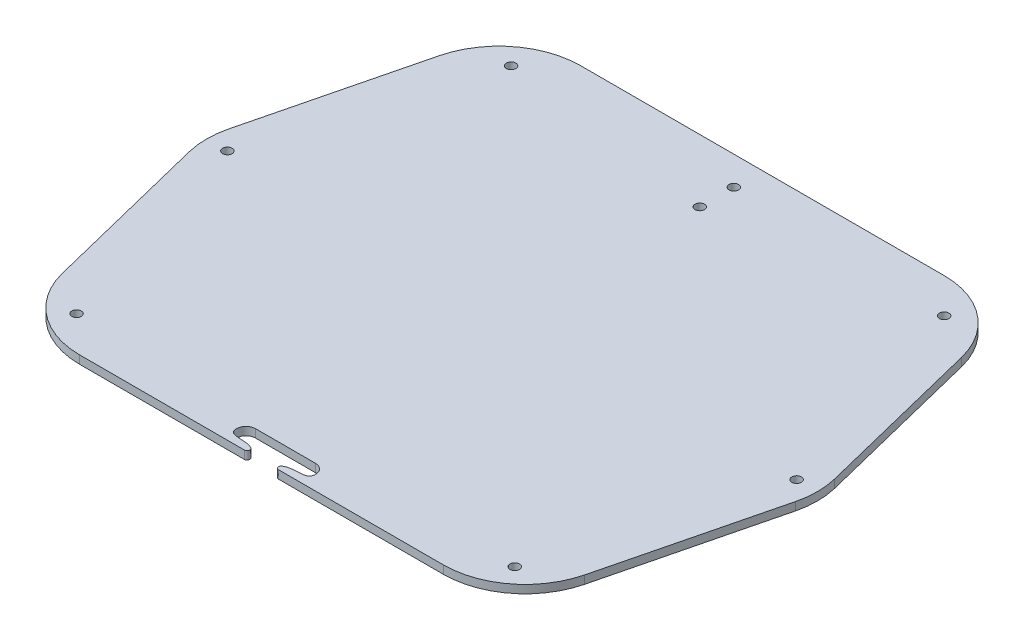
ISO-10303-21;
HEADER;
FILE_DESCRIPTION(('STEP AP214'),'2;1');
FILE_NAME('part.step','',(''),(''),'','','');
FILE_SCHEMA(('AUTOMOTIVE_DESIGN { 1 0 10303 214 1 1 1 1 }'));
ENDSEC;
DATA;
#1=APPLICATION_CONTEXT('core data for automotive mechanical design processes');
#2=APPLICATION_PROTOCOL_DEFINITION('international standard','automotive_design',2000,#1);
#3=PRODUCT_CONTEXT('',#1,'mechanical');
#4=PRODUCT('Part','Part','',(#3));
#5=PRODUCT_RELATED_PRODUCT_CATEGORY('part','',(#4));
#6=PRODUCT_DEFINITION_FORMATION('','',#4);
#7=PRODUCT_DEFINITION_CONTEXT('part definition',#1,'design');
#8=PRODUCT_DEFINITION('design','',#6,#7);
#9=PRODUCT_DEFINITION_SHAPE('','',#8);
#10=(LENGTH_UNIT() NAMED_UNIT(*) SI_UNIT(.MILLI.,.METRE.));
#11=(NAMED_UNIT(*) PLANE_ANGLE_UNIT() SI_UNIT($,.RADIAN.));
#12=(NAMED_UNIT(*) SI_UNIT($,.STERADIAN.) SOLID_ANGLE_UNIT());
#13=UNCERTAINTY_MEASURE_WITH_UNIT(LENGTH_MEASURE(1.E-05),#10,'distance_accuracy_value','');
#14=(GEOMETRIC_REPRESENTATION_CONTEXT(3) GLOBAL_UNCERTAINTY_ASSIGNED_CONTEXT((#13)) GLOBAL_UNIT_ASSIGNED_CONTEXT((#10,
#11,#12)) REPRESENTATION_CONTEXT('',''));
#15=CARTESIAN_POINT('',(0.,0.,0.));
#16=DIRECTION('',(0.,0.,1.));
#17=DIRECTION('',(1.,0.,0.));
#18=AXIS2_PLACEMENT_3D('',#15,#16,#17);
#19=CARTESIAN_POINT('',(0.,3.,29.3456606023015));
#20=DIRECTION('',(0.,0.,-1.));
#21=DIRECTION('',(-1.,0.,0.));
#22=AXIS2_PLACEMENT_3D('',#19,#20,#21);
#23=PLANE('',#22);
#24=DIRECTION('',(0.,1.,0.));
#25=VECTOR('',#24,1.);
#26=CARTESIAN_POINT('',(-6.29344842056771,-7.,29.3456606023015));
#27=LINE('',#26,#25);
#28=CARTESIAN_POINT('',(-6.29344842056771,0.,29.3456606023015));
#29=VERTEX_POINT('',#28);
#30=CARTESIAN_POINT('',(-6.29344842056771,3.,29.3456606023015));
#31=VERTEX_POINT('',#30);
#32=EDGE_CURVE('E311',#29,#31,#27,.T.);
#33=ORIENTED_EDGE('',*,*,#32,.T.);
#34=DIRECTION('',(1.,0.,0.));
#35=VECTOR('',#34,1.);
#36=CARTESIAN_POINT('',(0.,3.,29.3456606023015));
#37=LINE('',#36,#35);
#38=CARTESIAN_POINT('',(-66.7805914104085,3.,29.3456606023015));
#39=VERTEX_POINT('',#38);
#40=EDGE_CURVE('E166',#39,#31,#37,.T.);
#41=ORIENTED_EDGE('',*,*,#40,.F.);
#42=DIRECTION('',(0.,-1.,0.));
#43=VECTOR('',#42,1.);
#44=CARTESIAN_POINT('',(-66.7805914104085,3.,29.3456606023015));
#45=LINE('',#44,#43);
#46=CARTESIAN_POINT('',(-66.7805914104085,0.,29.3456606023015));
#47=VERTEX_POINT('',#46);
#48=EDGE_CURVE('E209',#39,#47,#45,.T.);
#49=ORIENTED_EDGE('',*,*,#48,.T.);
#50=DIRECTION('',(1.,0.,0.));
#51=VECTOR('',#50,1.);
#52=CARTESIAN_POINT('',(0.,0.,29.3456606023015));
#53=LINE('',#52,#51);
#54=EDGE_CURVE('E197',#47,#29,#53,.T.);
#55=ORIENTED_EDGE('',*,*,#54,.T.);
#56=EDGE_LOOP('',(#33,#41,#49,#55));
#57=FACE_BOUND('',#56,.T.);
#58=ADVANCED_FACE('F37',(#57),#23,.F.);
#59=CARTESIAN_POINT('',(121.136391037805,3.,-30.038561269979));
#60=DIRECTION('',(0.970603640808581,0.,-0.24068355251061));
#61=DIRECTION('',(-0.24068355251061,0.,-0.970603640808581));
#62=AXIS2_PLACEMENT_3D('',#59,#60,#61);
#63=PLANE('',#62);
#64=DIRECTION('',(0.24068355251061,0.,0.970603640808581));
#65=VECTOR('',#64,1.);
#66=CARTESIAN_POINT('',(121.136391037805,0.,-30.038561269979));
#67=LINE('',#66,#65);
#68=CARTESIAN_POINT('',(95.8987006346659,0.,-131.814498742093));
#69=VERTEX_POINT('',#68);
#70=CARTESIAN_POINT('',(111.265547961007,0.,-69.8446723575549));
#71=VERTEX_POINT('',#70);
#72=EDGE_CURVE('E173',#69,#71,#67,.T.);
#73=ORIENTED_EDGE('',*,*,#72,.F.);
#74=DIRECTION('',(0.,-1.,0.));
#75=VECTOR('',#74,1.);
#76=CARTESIAN_POINT('',(95.8987006346659,3.,-131.814498742093));
#77=LINE('',#76,#75);
#78=CARTESIAN_POINT('',(95.8987006346659,3.,-131.814498742093));
#79=VERTEX_POINT('',#78);
#80=EDGE_CURVE('E111',#79,#69,#77,.T.);
#81=ORIENTED_EDGE('',*,*,#80,.F.);
#82=DIRECTION('',(0.24068355251061,0.,0.970603640808581));
#83=VECTOR('',#82,1.);
#84=CARTESIAN_POINT('',(121.136391037805,3.,-30.038561269979));
#85=LINE('',#84,#83);
#86=CARTESIAN_POINT('',(111.265547961007,3.,-69.8446723575549));
#87=VERTEX_POINT('',#86);
#88=EDGE_CURVE('E205',#79,#87,#85,.T.);
#89=ORIENTED_EDGE('',*,*,#88,.T.);
#90=DIRECTION('',(0.,-1.,0.));
#91=VECTOR('',#90,1.);
#92=CARTESIAN_POINT('',(111.265547961007,3.,-69.8446723575549));
#93=LINE('',#92,#91);
#94=EDGE_CURVE('E106',#87,#71,#93,.T.);
#95=ORIENTED_EDGE('',*,*,#94,.T.);
#96=EDGE_LOOP('',(#73,#81,#89,#95));
#97=FACE_BOUND('',#96,.T.);
#98=ADVANCED_FACE('F39',(#97),#63,.T.);
#99=CARTESIAN_POINT('',(66.7805914104085,3.,-124.593992166775));
#100=DIRECTION('',(0.,-1.,0.));
#101=DIRECTION('',(0.,0.,-1.));
#102=AXIS2_PLACEMENT_3D('',#99,#100,#101);
#103=CYLINDRICAL_SURFACE('',#102,30.);
#104=CARTESIAN_POINT('',(66.7805914104085,0.,-124.593992166775));
#105=DIRECTION('',(0.,1.,0.));
#106=DIRECTION('',(0.,0.,1.));
#107=AXIS2_PLACEMENT_3D('',#104,#105,#106);
#108=CIRCLE('',#107,30.);
#109=CARTESIAN_POINT('',(66.7805914104085,0.,-154.593992166775));
#110=VERTEX_POINT('',#109);
#111=EDGE_CURVE('E176',#69,#110,#108,.T.);
#112=ORIENTED_EDGE('',*,*,#111,.T.);
#113=DIRECTION('',(0.,-1.,0.));
#114=VECTOR('',#113,1.);
#115=CARTESIAN_POINT('',(66.7805914104085,3.,-154.593992166775));
#116=LINE('',#115,#114);
#117=CARTESIAN_POINT('',(66.7805914104085,3.,-154.593992166775));
#118=VERTEX_POINT('',#117);
#119=EDGE_CURVE('E223',#118,#110,#116,.T.);
#120=ORIENTED_EDGE('',*,*,#119,.F.);
#121=CARTESIAN_POINT('',(66.7805914104085,3.,-124.593992166775));
#122=DIRECTION('',(0.,1.,0.));
#123=DIRECTION('',(0.,0.,1.));
#124=AXIS2_PLACEMENT_3D('',#121,#122,#123);
#125=CIRCLE('',#124,30.);
#126=EDGE_CURVE('E346',#79,#118,#125,.T.);
#127=ORIENTED_EDGE('',*,*,#126,.F.);
#128=ORIENTED_EDGE('',*,*,#80,.T.);
#129=EDGE_LOOP('',(#112,#120,#127,#128));
#130=FACE_BOUND('',#129,.T.);
#131=ADVANCED_FACE('F445',(#130),#103,.T.);
#132=CARTESIAN_POINT('',(0.,3.,-154.593992166775));
#133=DIRECTION('',(0.,0.,-1.));
#134=DIRECTION('',(-1.,0.,0.));
#135=AXIS2_PLACEMENT_3D('',#132,#133,#134);
#136=PLANE('',#135);
#137=DIRECTION('',(1.,0.,0.));
#138=VECTOR('',#137,1.);
#139=CARTESIAN_POINT('',(0.,0.,-154.593992166775));
#140=LINE('',#139,#138);
#141=CARTESIAN_POINT('',(-66.7805914104085,0.,-154.593992166775));
#142=VERTEX_POINT('',#141);
#143=EDGE_CURVE('E180',#142,#110,#140,.T.);
#144=ORIENTED_EDGE('',*,*,#143,.F.);
#145=DIRECTION('',(0.,-1.,0.));
#146=VECTOR('',#145,1.);
#147=CARTESIAN_POINT('',(-66.7805914104085,3.,-154.593992166775));
#148=LINE('',#147,#146);
#149=CARTESIAN_POINT('',(-66.7805914104085,3.,-154.593992166775));
#150=VERTEX_POINT('',#149);
#151=EDGE_CURVE('E221',#150,#142,#148,.T.);
#152=ORIENTED_EDGE('',*,*,#151,.F.);
#153=DIRECTION('',(1.,0.,0.));
#154=VECTOR('',#153,1.);
#155=CARTESIAN_POINT('',(0.,3.,-154.593992166775));
#156=LINE('',#155,#154);
#157=EDGE_CURVE('E348',#150,#118,#156,.T.);
#158=ORIENTED_EDGE('',*,*,#157,.T.);
#159=ORIENTED_EDGE('',*,*,#119,.T.);
#160=EDGE_LOOP('',(#144,#152,#158,#159));
#161=FACE_BOUND('',#160,.T.);
#162=ADVANCED_FACE('F449',(#161),#136,.T.);
#163=CARTESIAN_POINT('',(-66.7805914104085,3.,-124.593992166775));
#164=DIRECTION('',(0.,-1.,0.));
#165=DIRECTION('',(0.,0.,-1.));
#166=AXIS2_PLACEMENT_3D('',#163,#164,#165);
#167=CYLINDRICAL_SURFACE('',#166,30.);
#168=CARTESIAN_POINT('',(-66.7805914104085,0.,-124.593992166775));
#169=DIRECTION('',(0.,1.,0.));
#170=DIRECTION('',(0.,0.,1.));
#171=AXIS2_PLACEMENT_3D('',#168,#169,#170);
#172=CIRCLE('',#171,30.);
#173=CARTESIAN_POINT('',(-95.8987006346659,0.,-131.814498742093));
#174=VERTEX_POINT('',#173);
#175=EDGE_CURVE('E183',#142,#174,#172,.T.);
#176=ORIENTED_EDGE('',*,*,#175,.T.);
#177=DIRECTION('',(0.,-1.,0.));
#178=VECTOR('',#177,1.);
#179=CARTESIAN_POINT('',(-95.8987006346659,3.,-131.814498742093));
#180=LINE('',#179,#178);
#181=CARTESIAN_POINT('',(-95.8987006346659,3.,-131.814498742093));
#182=VERTEX_POINT('',#181);
#183=EDGE_CURVE('E218',#182,#174,#180,.T.);
#184=ORIENTED_EDGE('',*,*,#183,.F.);
#185=CARTESIAN_POINT('',(-66.7805914104085,3.,-124.593992166775));
#186=DIRECTION('',(0.,1.,0.));
#187=DIRECTION('',(0.,0.,1.));
#188=AXIS2_PLACEMENT_3D('',#185,#186,#187);
#189=CIRCLE('',#188,30.);
#190=EDGE_CURVE('E351',#150,#182,#189,.T.);
#191=ORIENTED_EDGE('',*,*,#190,.F.);
#192=ORIENTED_EDGE('',*,*,#151,.T.);
#193=EDGE_LOOP('',(#176,#184,#191,#192));
#194=FACE_BOUND('',#193,.T.);
#195=ADVANCED_FACE('F454',(#194),#167,.T.);
#196=CARTESIAN_POINT('',(-121.136391037805,3.,-30.038561269979));
#197=DIRECTION('',(0.970603640808581,0.,0.24068355251061));
#198=DIRECTION('',(0.24068355251061,0.,-0.970603640808581));
#199=AXIS2_PLACEMENT_3D('',#196,#197,#198);
#200=PLANE('',#199);
#201=DIRECTION('',(-0.24068355251061,0.,0.970603640808581));
#202=VECTOR('',#201,1.);
#203=CARTESIAN_POINT('',(-121.136391037805,0.,-30.038561269979));
#204=LINE('',#203,#202);
#205=CARTESIAN_POINT('',(-111.265547961007,0.,-69.8446723575549));
#206=VERTEX_POINT('',#205);
#207=EDGE_CURVE('E185',#174,#206,#204,.T.);
#208=ORIENTED_EDGE('',*,*,#207,.T.);
#209=DIRECTION('',(0.,-1.,0.));
#210=VECTOR('',#209,1.);
#211=CARTESIAN_POINT('',(-111.265547961007,3.,-69.8446723575549));
#212=LINE('',#211,#210);
#213=CARTESIAN_POINT('',(-111.265547961007,3.,-69.8446723575549));
#214=VERTEX_POINT('',#213);
#215=EDGE_CURVE('E215',#214,#206,#212,.T.);
#216=ORIENTED_EDGE('',*,*,#215,.F.);
#217=DIRECTION('',(-0.24068355251061,0.,0.970603640808581));
#218=VECTOR('',#217,1.);
#219=CARTESIAN_POINT('',(-121.136391037805,3.,-30.038561269979));
#220=LINE('',#219,#218);
#221=EDGE_CURVE('E353',#182,#214,#220,.T.);
#222=ORIENTED_EDGE('',*,*,#221,.F.);
#223=ORIENTED_EDGE('',*,*,#183,.T.);
#224=EDGE_LOOP('',(#208,#216,#222,#223));
#225=FACE_BOUND('',#224,.T.);
#226=ADVANCED_FACE('F458',(#225),#200,.F.);
#227=CARTESIAN_POINT('',(-82.1474387367497,3.,-62.6241657822366));
#228=DIRECTION('',(0.,-1.,0.));
#229=DIRECTION('',(0.,0.,-1.));
#230=AXIS2_PLACEMENT_3D('',#227,#228,#229);
#231=CYLINDRICAL_SURFACE('',#230,30.);
#232=CARTESIAN_POINT('',(-82.1474387367497,0.,-62.6241657822366));
#233=DIRECTION('',(0.,1.,0.));
#234=DIRECTION('',(0.,0.,1.));
#235=AXIS2_PLACEMENT_3D('',#232,#233,#234);
#236=CIRCLE('',#235,30.);
#237=CARTESIAN_POINT('',(-111.265547961007,0.,-55.4036592069183));
#238=VERTEX_POINT('',#237);
#239=EDGE_CURVE('E187',#206,#238,#236,.T.);
#240=ORIENTED_EDGE('',*,*,#239,.T.);
#241=DIRECTION('',(0.,-1.,0.));
#242=VECTOR('',#241,1.);
#243=CARTESIAN_POINT('',(-111.265547961007,3.,-55.4036592069183));
#244=LINE('',#243,#242);
#245=CARTESIAN_POINT('',(-111.265547961007,3.,-55.4036592069183));
#246=VERTEX_POINT('',#245);
#247=EDGE_CURVE('E213',#246,#238,#244,.T.);
#248=ORIENTED_EDGE('',*,*,#247,.F.);
#249=CARTESIAN_POINT('',(-82.1474387367497,3.,-62.6241657822366));
#250=DIRECTION('',(0.,1.,0.));
#251=DIRECTION('',(0.,0.,1.));
#252=AXIS2_PLACEMENT_3D('',#249,#250,#251);
#253=CIRCLE('',#252,30.);
#254=EDGE_CURVE('E355',#214,#246,#253,.T.);
#255=ORIENTED_EDGE('',*,*,#254,.F.);
#256=ORIENTED_EDGE('',*,*,#215,.T.);
#257=EDGE_LOOP('',(#240,#248,#255,#256));
#258=FACE_BOUND('',#257,.T.);
#259=ADVANCED_FACE('F461',(#258),#231,.T.);
#260=CARTESIAN_POINT('',(-91.8773371714655,3.,22.7831042208141));
#261=DIRECTION('',(-0.970603640808581,0.,0.24068355251061));
#262=DIRECTION('',(0.24068355251061,0.,0.970603640808581));
#263=AXIS2_PLACEMENT_3D('',#260,#261,#262);
#264=PLANE('',#263);
#265=DIRECTION('',(-0.24068355251061,0.,-0.970603640808581));
#266=VECTOR('',#265,1.);
#267=CARTESIAN_POINT('',(-91.8773371714655,0.,22.7831042208141));
#268=LINE('',#267,#266);
#269=CARTESIAN_POINT('',(-95.8987006346659,0.,6.56616717761984));
#270=VERTEX_POINT('',#269);
#271=EDGE_CURVE('E190',#270,#238,#268,.T.);
#272=ORIENTED_EDGE('',*,*,#271,.F.);
#273=DIRECTION('',(0.,-1.,0.));
#274=VECTOR('',#273,1.);
#275=CARTESIAN_POINT('',(-95.8987006346659,3.,6.56616717761984));
#276=LINE('',#275,#274);
#277=CARTESIAN_POINT('',(-95.8987006346659,3.,6.56616717761984));
#278=VERTEX_POINT('',#277);
#279=EDGE_CURVE('E211',#278,#270,#276,.T.);
#280=ORIENTED_EDGE('',*,*,#279,.F.);
#281=DIRECTION('',(-0.24068355251061,0.,-0.970603640808581));
#282=VECTOR('',#281,1.);
#283=CARTESIAN_POINT('',(-91.8773371714655,3.,22.7831042208141));
#284=LINE('',#283,#282);
#285=EDGE_CURVE('E357',#278,#246,#284,.T.);
#286=ORIENTED_EDGE('',*,*,#285,.T.);
#287=ORIENTED_EDGE('',*,*,#247,.T.);
#288=EDGE_LOOP('',(#272,#280,#286,#287));
#289=FACE_BOUND('',#288,.T.);
#290=ADVANCED_FACE('F373',(#289),#264,.T.);
#291=CARTESIAN_POINT('',(-66.7805914104085,3.,-0.654339397698461));
#292=DIRECTION('',(0.,-1.,0.));
#293=DIRECTION('',(0.,0.,-1.));
#294=AXIS2_PLACEMENT_3D('',#291,#292,#293);
#295=CYLINDRICAL_SURFACE('',#294,30.);
#296=CARTESIAN_POINT('',(-66.7805914104085,0.,-0.654339397698461));
#297=DIRECTION('',(0.,1.,0.));
#298=DIRECTION('',(0.,0.,1.));
#299=AXIS2_PLACEMENT_3D('',#296,#297,#298);
#300=CIRCLE('',#299,30.);
#301=EDGE_CURVE('E193',#47,#270,#300,.F.);
#302=ORIENTED_EDGE('',*,*,#301,.F.);
#303=ORIENTED_EDGE('',*,*,#48,.F.);
#304=CARTESIAN_POINT('',(-66.7805914104085,3.,-0.654339397698461));
#305=DIRECTION('',(0.,1.,0.));
#306=DIRECTION('',(0.,0.,1.));
#307=AXIS2_PLACEMENT_3D('',#304,#305,#306);
#308=CIRCLE('',#307,30.);
#309=EDGE_CURVE('E359',#39,#278,#308,.F.);
#310=ORIENTED_EDGE('',*,*,#309,.T.);
#311=ORIENTED_EDGE('',*,*,#279,.T.);
#312=EDGE_LOOP('',(#302,#303,#310,#311));
#313=FACE_BOUND('',#312,.T.);
#314=ADVANCED_FACE('F364',(#313),#295,.T.);
#315=CARTESIAN_POINT('',(6.29344842056773,3.,29.3456606023015));
#316=VERTEX_POINT('',#315);
#317=CARTESIAN_POINT('',(66.7805914104085,3.,29.3456606023015));
#318=VERTEX_POINT('',#317);
#319=EDGE_CURVE('E164',#316,#318,#37,.T.);
#320=ORIENTED_EDGE('',*,*,#319,.F.);
#321=DIRECTION('',(0.,1.,0.));
#322=VECTOR('',#321,1.);
#323=CARTESIAN_POINT('',(6.29344842056773,-7.,29.3456606023015));
#324=LINE('',#323,#322);
#325=CARTESIAN_POINT('',(6.29344842056773,0.,29.3456606023015));
#326=VERTEX_POINT('',#325);
#327=EDGE_CURVE('E308',#326,#316,#324,.T.);
#328=ORIENTED_EDGE('',*,*,#327,.F.);
#329=CARTESIAN_POINT('',(66.7805914104085,0.,29.3456606023015));
#330=VERTEX_POINT('',#329);
#331=EDGE_CURVE('E196',#326,#330,#53,.T.);
#332=ORIENTED_EDGE('',*,*,#331,.T.);
#333=DIRECTION('',(0.,-1.,0.));
#334=VECTOR('',#333,1.);
#335=CARTESIAN_POINT('',(66.7805914104085,3.,29.3456606023015));
#336=LINE('',#335,#334);
#337=EDGE_CURVE('E152',#318,#330,#336,.T.);
#338=ORIENTED_EDGE('',*,*,#337,.F.);
#339=EDGE_LOOP('',(#320,#328,#332,#338));
#340=FACE_BOUND('',#339,.T.);
#341=ADVANCED_FACE('F438',(#340),#23,.F.);
#342=CARTESIAN_POINT('',(66.7805914104085,3.,-0.654339397698461));
#343=DIRECTION('',(0.,-1.,0.));
#344=DIRECTION('',(0.,0.,-1.));
#345=AXIS2_PLACEMENT_3D('',#342,#343,#344);
#346=CYLINDRICAL_SURFACE('',#345,30.);
#347=CARTESIAN_POINT('',(66.7805914104085,0.,-0.654339397698461));
#348=DIRECTION('',(0.,1.,0.));
#349=DIRECTION('',(0.,0.,1.));
#350=AXIS2_PLACEMENT_3D('',#347,#348,#349);
#351=CIRCLE('',#350,30.);
#352=CARTESIAN_POINT('',(95.8987006346659,0.,6.56616717761984));
#353=VERTEX_POINT('',#352);
#354=EDGE_CURVE('E149',#353,#330,#351,.F.);
#355=ORIENTED_EDGE('',*,*,#354,.F.);
#356=DIRECTION('',(0.,-1.,0.));
#357=VECTOR('',#356,1.);
#358=CARTESIAN_POINT('',(95.8987006346659,3.,6.56616717761984));
#359=LINE('',#358,#357);
#360=CARTESIAN_POINT('',(95.8987006346659,3.,6.56616717761984));
#361=VERTEX_POINT('',#360);
#362=EDGE_CURVE('E142',#361,#353,#359,.T.);
#363=ORIENTED_EDGE('',*,*,#362,.F.);
#364=CARTESIAN_POINT('',(66.7805914104085,3.,-0.654339397698461));
#365=DIRECTION('',(0.,1.,0.));
#366=DIRECTION('',(0.,0.,1.));
#367=AXIS2_PLACEMENT_3D('',#364,#365,#366);
#368=CIRCLE('',#367,30.);
#369=EDGE_CURVE('E147',#361,#318,#368,.F.);
#370=ORIENTED_EDGE('',*,*,#369,.T.);
#371=ORIENTED_EDGE('',*,*,#337,.T.);
#372=EDGE_LOOP('',(#355,#363,#370,#371));
#373=FACE_BOUND('',#372,.T.);
#374=ADVANCED_FACE('F144',(#373),#346,.T.);
#375=CARTESIAN_POINT('',(91.8773371714655,3.,22.783104220814));
#376=DIRECTION('',(-0.970603640808581,0.,-0.24068355251061));
#377=DIRECTION('',(-0.24068355251061,0.,0.970603640808581));
#378=AXIS2_PLACEMENT_3D('',#375,#376,#377);
#379=PLANE('',#378);
#380=DIRECTION('',(0.24068355251061,0.,-0.970603640808581));
#381=VECTOR('',#380,1.);
#382=CARTESIAN_POINT('',(91.8773371714655,0.,22.783104220814));
#383=LINE('',#382,#381);
#384=CARTESIAN_POINT('',(111.265547961007,0.,-55.4036592069183));
#385=VERTEX_POINT('',#384);
#386=EDGE_CURVE('E201',#353,#385,#383,.T.);
#387=ORIENTED_EDGE('',*,*,#386,.T.);
#388=DIRECTION('',(0.,-1.,0.));
#389=VECTOR('',#388,1.);
#390=CARTESIAN_POINT('',(111.265547961007,3.,-55.4036592069183));
#391=LINE('',#390,#389);
#392=CARTESIAN_POINT('',(111.265547961007,3.,-55.4036592069183));
#393=VERTEX_POINT('',#392);
#394=EDGE_CURVE('E153',#393,#385,#391,.T.);
#395=ORIENTED_EDGE('',*,*,#394,.F.);
#396=DIRECTION('',(0.24068355251061,0.,-0.970603640808581));
#397=VECTOR('',#396,1.);
#398=CARTESIAN_POINT('',(91.8773371714655,3.,22.783104220814));
#399=LINE('',#398,#397);
#400=EDGE_CURVE('E156',#361,#393,#399,.T.);
#401=ORIENTED_EDGE('',*,*,#400,.F.);
#402=ORIENTED_EDGE('',*,*,#362,.T.);
#403=EDGE_LOOP('',(#387,#395,#401,#402));
#404=FACE_BOUND('',#403,.T.);
#405=ADVANCED_FACE('F157',(#404),#379,.F.);
#406=CARTESIAN_POINT('',(82.1474387367497,3.,-62.6241657822366));
#407=DIRECTION('',(0.,-1.,0.));
#408=DIRECTION('',(0.,0.,-1.));
#409=AXIS2_PLACEMENT_3D('',#406,#407,#408);
#410=CYLINDRICAL_SURFACE('',#409,30.);
#411=CARTESIAN_POINT('',(82.1474387367497,0.,-62.6241657822366));
#412=DIRECTION('',(0.,1.,0.));
#413=DIRECTION('',(0.,0.,1.));
#414=AXIS2_PLACEMENT_3D('',#411,#412,#413);
#415=CIRCLE('',#414,30.);
#416=EDGE_CURVE('E203',#385,#71,#415,.T.);
#417=ORIENTED_EDGE('',*,*,#416,.T.);
#418=ORIENTED_EDGE('',*,*,#94,.F.);
#419=CARTESIAN_POINT('',(82.1474387367497,3.,-62.6241657822366));
#420=DIRECTION('',(0.,1.,0.));
#421=DIRECTION('',(0.,0.,1.));
#422=AXIS2_PLACEMENT_3D('',#419,#420,#421);
#423=CIRCLE('',#422,30.);
#424=EDGE_CURVE('E61',#393,#87,#423,.T.);
#425=ORIENTED_EDGE('',*,*,#424,.F.);
#426=ORIENTED_EDGE('',*,*,#394,.T.);
#427=EDGE_LOOP('',(#417,#418,#425,#426));
#428=FACE_BOUND('',#427,.T.);
#429=ADVANCED_FACE('F441',(#428),#410,.T.);
#430=CARTESIAN_POINT('',(0.,3.,0.));
#431=DIRECTION('',(0.,1.,0.));
#432=DIRECTION('',(0.,0.,1.));
#433=AXIS2_PLACEMENT_3D('',#430,#431,#432);
#434=PLANE('',#433);
#435=CARTESIAN_POINT('',(6.29344842056773,3.,28.3456606023015));
#436=DIRECTION('',(0.,-1.,0.));
#437=DIRECTION('',(0.,0.,1.));
#438=AXIS2_PLACEMENT_3D('',#435,#436,#437);
#439=CIRCLE('',#438,1.);
#440=CARTESIAN_POINT('',(5.80457635502105,3.,27.4733051108142));
#441=VERTEX_POINT('',#440);
#442=EDGE_CURVE('E306',#316,#441,#439,.T.);
#443=ORIENTED_EDGE('',*,*,#442,.F.);
#444=ORIENTED_EDGE('',*,*,#319,.T.);
#445=ORIENTED_EDGE('',*,*,#369,.F.);
#446=ORIENTED_EDGE('',*,*,#400,.T.);
#447=ORIENTED_EDGE('',*,*,#424,.T.);
#448=ORIENTED_EDGE('',*,*,#88,.F.);
#449=ORIENTED_EDGE('',*,*,#126,.T.);
#450=ORIENTED_EDGE('',*,*,#157,.F.);
#451=ORIENTED_EDGE('',*,*,#190,.T.);
#452=ORIENTED_EDGE('',*,*,#221,.T.);
#453=ORIENTED_EDGE('',*,*,#254,.T.);
#454=ORIENTED_EDGE('',*,*,#285,.F.);
#455=ORIENTED_EDGE('',*,*,#309,.F.);
#456=ORIENTED_EDGE('',*,*,#40,.T.);
#457=CARTESIAN_POINT('',(-6.29344842056771,3.,28.3456606023015));
#458=DIRECTION('',(0.,-1.,0.));
#459=DIRECTION('',(0.,0.,1.));
#460=AXIS2_PLACEMENT_3D('',#457,#458,#459);
#461=CIRCLE('',#460,1.);
#462=CARTESIAN_POINT('',(-5.80457635502104,3.,27.4733051108142));
#463=VERTEX_POINT('',#462);
#464=EDGE_CURVE('E427',#463,#31,#461,.T.);
#465=ORIENTED_EDGE('',*,*,#464,.F.);
#466=CARTESIAN_POINT('',(-14.3784570925038,3.,24.9876745493891));
#467=CARTESIAN_POINT('',(-14.0506615471462,3.,26.1193369399275));
#468=CARTESIAN_POINT('',(-10.489346866623,3.,26.7600909903028));
#469=CARTESIAN_POINT('',(-7.72474957365098,3.,26.4937574664827));
#470=CARTESIAN_POINT('',(-5.90450881564876,3.,27.4173024961474));
#471=CARTESIAN_POINT('',(-5.80457635502104,3.,27.4733051108142));
#472=B_SPLINE_CURVE_WITH_KNOTS('',3,(#466,#467,#468,#469,#470,#471),.UNSPECIFIED.,.F.,.F.,(4,1,
1,4),(0.,0.27412385349263,0.745489655390744,0.777393607827548),.UNSPECIFIED.);
#473=CARTESIAN_POINT('',(-14.3784570925038,3.,24.9876745493891));
#474=VERTEX_POINT('',#473);
#475=EDGE_CURVE('E419',#474,#463,#472,.T.);
#476=ORIENTED_EDGE('',*,*,#475,.F.);
#477=CARTESIAN_POINT('',(-11.0166480970681,3.,24.0138982515634));
#478=DIRECTION('',(0.,1.,0.));
#479=DIRECTION('',(0.,0.,1.));
#480=AXIS2_PLACEMENT_3D('',#477,#478,#479);
#481=CIRCLE('',#480,3.5);
#482=CARTESIAN_POINT('',(-11.0166480970681,3.,20.5138982515634));
#483=VERTEX_POINT('',#482);
#484=EDGE_CURVE('E417',#483,#474,#481,.T.);
#485=ORIENTED_EDGE('',*,*,#484,.F.);
#486=DIRECTION('',(-1.,0.,0.));
#487=VECTOR('',#486,1.);
#488=CARTESIAN_POINT('',(11.0166480970681,3.,20.5138982515634));
#489=LINE('',#488,#487);
#490=CARTESIAN_POINT('',(11.0166480970681,3.,20.5138982515634));
#491=VERTEX_POINT('',#490);
#492=EDGE_CURVE('E408',#491,#483,#489,.T.);
#493=ORIENTED_EDGE('',*,*,#492,.F.);
#494=CARTESIAN_POINT('',(11.0166480970681,3.,24.0138982515634));
#495=DIRECTION('',(0.,1.,0.));
#496=DIRECTION('',(0.,0.,1.));
#497=AXIS2_PLACEMENT_3D('',#494,#495,#496);
#498=CIRCLE('',#497,3.5);
#499=CARTESIAN_POINT('',(14.3784570925038,3.,24.9876745493891));
#500=VERTEX_POINT('',#499);
#501=EDGE_CURVE('E412',#500,#491,#498,.T.);
#502=ORIENTED_EDGE('',*,*,#501,.F.);
#503=CARTESIAN_POINT('',(5.80457635502104,3.,27.4733051108142));
#504=CARTESIAN_POINT('',(5.90450881564877,3.,27.4173024961474));
#505=CARTESIAN_POINT('',(7.724749573651,3.,26.4937574664827));
#506=CARTESIAN_POINT('',(10.489346866623,3.,26.7600909903028));
#507=CARTESIAN_POINT('',(14.0506615471462,3.,26.1193369399275));
#508=CARTESIAN_POINT('',(14.3784570925038,3.,24.9876745493891));
#509=B_SPLINE_CURVE_WITH_KNOTS('',3,(#503,#504,#505,#506,#507,#508),.UNSPECIFIED.,.F.,.F.,(4,1,
1,4),(0.,0.0319039524368033,0.503269754334918,0.777393607827548),.UNSPECIFIED.);
#510=EDGE_CURVE('E327',#441,#500,#509,.T.);
#511=ORIENTED_EDGE('',*,*,#510,.F.);
#512=EDGE_LOOP('',(#443,#444,#445,#446,#447,#448,#449,#450,#451,#452,#453,#454,#455,#456,#465,
#476,#485,#493,#502,#511));
#513=FACE_BOUND('',#512,.T.);
#514=CARTESIAN_POINT('',(79.5,3.,-141.782265329937));
#515=DIRECTION('',(0.,1.,0.));
#516=DIRECTION('',(0.,0.,1.));
#517=AXIS2_PLACEMENT_3D('',#514,#515,#516);
#518=CIRCLE('',#517,1.75);
#519=CARTESIAN_POINT('',(79.5,3.,-140.032265329937));
#520=VERTEX_POINT('',#519);
#521=EDGE_CURVE('E256',#520,#520,#518,.T.);
#522=ORIENTED_EDGE('',*,*,#521,.F.);
#523=EDGE_LOOP('',(#522));
#524=FACE_BOUND('',#523,.T.);
#525=CARTESIAN_POINT('',(-79.5,3.,-141.782265329937));
#526=DIRECTION('',(0.,1.,0.));
#527=DIRECTION('',(0.,0.,1.));
#528=AXIS2_PLACEMENT_3D('',#525,#526,#527);
#529=CIRCLE('',#528,1.75);
#530=CARTESIAN_POINT('',(-79.5,3.,-140.032265329937));
#531=VERTEX_POINT('',#530);
#532=EDGE_CURVE('E252',#531,#531,#529,.T.);
#533=ORIENTED_EDGE('',*,*,#532,.F.);
#534=EDGE_LOOP('',(#533));
#535=FACE_BOUND('',#534,.T.);
#536=CARTESIAN_POINT('',(0.,3.,-144.079729863551));
#537=DIRECTION('',(0.,1.,0.));
#538=DIRECTION('',(0.,0.,1.));
#539=AXIS2_PLACEMENT_3D('',#536,#537,#538);
#540=CIRCLE('',#539,1.75);
#541=CARTESIAN_POINT('',(0.,3.,-142.329729863551));
#542=VERTEX_POINT('',#541);
#543=EDGE_CURVE('E248',#542,#542,#540,.T.);
#544=ORIENTED_EDGE('',*,*,#543,.F.);
#545=EDGE_LOOP('',(#544));
#546=FACE_BOUND('',#545,.T.);
#547=CARTESIAN_POINT('',(0.,3.,-131.568155220661));
#548=DIRECTION('',(0.,1.,0.));
#549=DIRECTION('',(0.,0.,1.));
#550=AXIS2_PLACEMENT_3D('',#547,#548,#549);
#551=CIRCLE('',#550,1.75);
#552=CARTESIAN_POINT('',(0.,3.,-129.818155220661));
#553=VERTEX_POINT('',#552);
#554=EDGE_CURVE('E244',#553,#553,#551,.T.);
#555=ORIENTED_EDGE('',*,*,#554,.F.);
#556=EDGE_LOOP('',(#555));
#557=FACE_BOUND('',#556,.T.);
#558=CARTESIAN_POINT('',(-80.4501847084653,3.,16.8189513065068));
#559=DIRECTION('',(0.,1.,0.));
#560=DIRECTION('',(0.,0.,1.));
#561=AXIS2_PLACEMENT_3D('',#558,#559,#560);
#562=CIRCLE('',#561,1.75);
#563=CARTESIAN_POINT('',(-80.4501847084653,3.,18.5689513065068));
#564=VERTEX_POINT('',#563);
#565=EDGE_CURVE('E234',#564,#564,#562,.T.);
#566=ORIENTED_EDGE('',*,*,#565,.F.);
#567=EDGE_LOOP('',(#566));
#568=FACE_BOUND('',#567,.T.);
#569=CARTESIAN_POINT('',(104.507530950677,3.,-62.6241657822366));
#570=DIRECTION('',(0.,1.,0.));
#571=DIRECTION('',(0.,0.,1.));
#572=AXIS2_PLACEMENT_3D('',#569,#570,#571);
#573=CIRCLE('',#572,1.75);
#574=CARTESIAN_POINT('',(104.507530950677,3.,-60.8741657822366));
#575=VERTEX_POINT('',#574);
#576=EDGE_CURVE('E338',#575,#575,#573,.T.);
#577=ORIENTED_EDGE('',*,*,#576,.F.);
#578=EDGE_LOOP('',(#577));
#579=FACE_BOUND('',#578,.T.);
#580=CARTESIAN_POINT('',(80.4501847084653,3.,16.8189513065068));
#581=DIRECTION('',(0.,1.,0.));
#582=DIRECTION('',(0.,0.,1.));
#583=AXIS2_PLACEMENT_3D('',#580,#581,#582);
#584=CIRCLE('',#583,1.75);
#585=CARTESIAN_POINT('',(80.4501847084653,3.,18.5689513065068));
#586=VERTEX_POINT('',#585);
#587=EDGE_CURVE('E243',#586,#586,#584,.T.);
#588=ORIENTED_EDGE('',*,*,#587,.F.);
#589=EDGE_LOOP('',(#588));
#590=FACE_BOUND('',#589,.T.);
#591=CARTESIAN_POINT('',(-104.507530950677,3.,-62.6241657822366));
#592=DIRECTION('',(0.,1.,0.));
#593=DIRECTION('',(0.,0.,1.));
#594=AXIS2_PLACEMENT_3D('',#591,#592,#593);
#595=CIRCLE('',#594,1.75);
#596=CARTESIAN_POINT('',(-104.507530950677,3.,-60.8741657822366));
#597=VERTEX_POINT('',#596);
#598=EDGE_CURVE('E229',#597,#597,#595,.T.);
#599=ORIENTED_EDGE('',*,*,#598,.F.);
#600=EDGE_LOOP('',(#599));
#601=FACE_BOUND('',#600,.T.);
#602=ADVANCED_FACE('F161',(#513,#524,#535,#546,#557,#568,#579,#590,#601),#434,.T.);
#603=CARTESIAN_POINT('',(0.,0.,0.));
#604=DIRECTION('',(0.,1.,0.));
#605=DIRECTION('',(0.,0.,1.));
#606=AXIS2_PLACEMENT_3D('',#603,#604,#605);
#607=PLANE('',#606);
#608=ORIENTED_EDGE('',*,*,#331,.F.);
#609=CARTESIAN_POINT('',(6.29344842056773,0.,28.3456606023015));
#610=DIRECTION('',(0.,1.,0.));
#611=DIRECTION('',(0.,0.,1.));
#612=AXIS2_PLACEMENT_3D('',#609,#610,#611);
#613=CIRCLE('',#612,1.);
#614=CARTESIAN_POINT('',(5.80457635502105,0.,27.4733051108142));
#615=VERTEX_POINT('',#614);
#616=EDGE_CURVE('E11',#326,#615,#613,.F.);
#617=ORIENTED_EDGE('',*,*,#616,.T.);
#618=CARTESIAN_POINT('',(5.80457635502104,0.,27.4733051108142));
#619=CARTESIAN_POINT('',(5.90450881564877,0.,27.4173024961474));
#620=CARTESIAN_POINT('',(7.724749573651,0.,26.4937574664827));
#621=CARTESIAN_POINT('',(10.489346866623,0.,26.7600909903028));
#622=CARTESIAN_POINT('',(14.0506615471462,0.,26.1193369399275));
#623=CARTESIAN_POINT('',(14.3784570925038,0.,24.9876745493891));
#624=B_SPLINE_CURVE_WITH_KNOTS('',3,(#618,#619,#620,#621,#622,#623),.UNSPECIFIED.,.F.,.F.,(4,1,
1,4),(0.,0.0319039524368033,0.503269754334918,0.777393607827548),.UNSPECIFIED.);
#625=CARTESIAN_POINT('',(14.3784570925038,0.,24.9876745493891));
#626=VERTEX_POINT('',#625);
#627=EDGE_CURVE('E45',#615,#626,#624,.T.);
#628=ORIENTED_EDGE('',*,*,#627,.T.);
#629=CARTESIAN_POINT('',(11.0166480970681,0.,24.0138982515634));
#630=DIRECTION('',(0.,1.,0.));
#631=DIRECTION('',(0.,0.,1.));
#632=AXIS2_PLACEMENT_3D('',#629,#630,#631);
#633=CIRCLE('',#632,3.5);
#634=CARTESIAN_POINT('',(11.0166480970681,0.,20.5138982515634));
#635=VERTEX_POINT('',#634);
#636=EDGE_CURVE('E273',#626,#635,#633,.T.);
#637=ORIENTED_EDGE('',*,*,#636,.T.);
#638=DIRECTION('',(-1.,0.,0.));
#639=VECTOR('',#638,1.);
#640=CARTESIAN_POINT('',(0.,0.,20.5138982515634));
#641=LINE('',#640,#639);
#642=CARTESIAN_POINT('',(-11.0166480970681,0.,20.5138982515634));
#643=VERTEX_POINT('',#642);
#644=EDGE_CURVE('E226',#635,#643,#641,.T.);
#645=ORIENTED_EDGE('',*,*,#644,.T.);
#646=CARTESIAN_POINT('',(-11.0166480970681,0.,24.0138982515634));
#647=DIRECTION('',(0.,1.,0.));
#648=DIRECTION('',(0.,0.,1.));
#649=AXIS2_PLACEMENT_3D('',#646,#647,#648);
#650=CIRCLE('',#649,3.5);
#651=CARTESIAN_POINT('',(-14.3784570925038,0.,24.9876745493891));
#652=VERTEX_POINT('',#651);
#653=EDGE_CURVE('E259',#643,#652,#650,.T.);
#654=ORIENTED_EDGE('',*,*,#653,.T.);
#655=CARTESIAN_POINT('',(-14.3784570925038,0.,24.9876745493891));
#656=CARTESIAN_POINT('',(-14.0506615471462,0.,26.1193369399275));
#657=CARTESIAN_POINT('',(-10.489346866623,0.,26.7600909903028));
#658=CARTESIAN_POINT('',(-7.72474957365098,0.,26.4937574664827));
#659=CARTESIAN_POINT('',(-5.90450881564876,0.,27.4173024961474));
#660=CARTESIAN_POINT('',(-5.80457635502104,0.,27.4733051108142));
#661=B_SPLINE_CURVE_WITH_KNOTS('',3,(#655,#656,#657,#658,#659,#660),.UNSPECIFIED.,.F.,.F.,(4,1,
1,4),(0.,0.27412385349263,0.745489655390744,0.777393607827548),.UNSPECIFIED.);
#662=CARTESIAN_POINT('',(-5.80457635502104,0.,27.4733051108142));
#663=VERTEX_POINT('',#662);
#664=EDGE_CURVE('E262',#652,#663,#661,.T.);
#665=ORIENTED_EDGE('',*,*,#664,.T.);
#666=CARTESIAN_POINT('',(-6.29344842056771,0.,28.3456606023015));
#667=DIRECTION('',(0.,1.,0.));
#668=DIRECTION('',(0.,0.,1.));
#669=AXIS2_PLACEMENT_3D('',#666,#667,#668);
#670=CIRCLE('',#669,1.);
#671=EDGE_CURVE('E267',#663,#29,#670,.F.);
#672=ORIENTED_EDGE('',*,*,#671,.T.);
#673=ORIENTED_EDGE('',*,*,#54,.F.);
#674=ORIENTED_EDGE('',*,*,#301,.T.);
#675=ORIENTED_EDGE('',*,*,#271,.T.);
#676=ORIENTED_EDGE('',*,*,#239,.F.);
#677=ORIENTED_EDGE('',*,*,#207,.F.);
#678=ORIENTED_EDGE('',*,*,#175,.F.);
#679=ORIENTED_EDGE('',*,*,#143,.T.);
#680=ORIENTED_EDGE('',*,*,#111,.F.);
#681=ORIENTED_EDGE('',*,*,#72,.T.);
#682=ORIENTED_EDGE('',*,*,#416,.F.);
#683=ORIENTED_EDGE('',*,*,#386,.F.);
#684=ORIENTED_EDGE('',*,*,#354,.T.);
#685=EDGE_LOOP('',(#608,#617,#628,#637,#645,#654,#665,#672,#673,#674,#675,#676,#677,#678,#679,
#680,#681,#682,#683,#684));
#686=FACE_BOUND('',#685,.T.);
#687=CARTESIAN_POINT('',(79.5,0.,-141.782265329937));
#688=DIRECTION('',(0.,1.,0.));
#689=DIRECTION('',(0.,0.,1.));
#690=AXIS2_PLACEMENT_3D('',#687,#688,#689);
#691=CIRCLE('',#690,1.75);
#692=CARTESIAN_POINT('',(79.5,0.,-140.032265329937));
#693=VERTEX_POINT('',#692);
#694=EDGE_CURVE('E253',#693,#693,#691,.T.);
#695=ORIENTED_EDGE('',*,*,#694,.T.);
#696=EDGE_LOOP('',(#695));
#697=FACE_BOUND('',#696,.T.);
#698=CARTESIAN_POINT('',(-79.5,0.,-141.782265329937));
#699=DIRECTION('',(0.,1.,0.));
#700=DIRECTION('',(0.,0.,1.));
#701=AXIS2_PLACEMENT_3D('',#698,#699,#700);
#702=CIRCLE('',#701,1.75);
#703=CARTESIAN_POINT('',(-79.5,0.,-140.032265329937));
#704=VERTEX_POINT('',#703);
#705=EDGE_CURVE('E249',#704,#704,#702,.T.);
#706=ORIENTED_EDGE('',*,*,#705,.T.);
#707=EDGE_LOOP('',(#706));
#708=FACE_BOUND('',#707,.T.);
#709=CARTESIAN_POINT('',(0.,0.,-144.079729863551));
#710=DIRECTION('',(0.,1.,0.));
#711=DIRECTION('',(0.,0.,1.));
#712=AXIS2_PLACEMENT_3D('',#709,#710,#711);
#713=CIRCLE('',#712,1.75);
#714=CARTESIAN_POINT('',(0.,0.,-142.329729863551));
#715=VERTEX_POINT('',#714);
#716=EDGE_CURVE('E245',#715,#715,#713,.T.);
#717=ORIENTED_EDGE('',*,*,#716,.T.);
#718=EDGE_LOOP('',(#717));
#719=FACE_BOUND('',#718,.T.);
#720=CARTESIAN_POINT('',(0.,0.,-131.568155220661));
#721=DIRECTION('',(0.,1.,0.));
#722=DIRECTION('',(0.,0.,1.));
#723=AXIS2_PLACEMENT_3D('',#720,#721,#722);
#724=CIRCLE('',#723,1.75);
#725=CARTESIAN_POINT('',(0.,0.,-129.818155220661));
#726=VERTEX_POINT('',#725);
#727=EDGE_CURVE('E240',#726,#726,#724,.T.);
#728=ORIENTED_EDGE('',*,*,#727,.T.);
#729=EDGE_LOOP('',(#728));
#730=FACE_BOUND('',#729,.T.);
#731=CARTESIAN_POINT('',(-80.4501847084653,0.,16.8189513065068));
#732=DIRECTION('',(0.,1.,0.));
#733=DIRECTION('',(0.,0.,1.));
#734=AXIS2_PLACEMENT_3D('',#731,#732,#733);
#735=CIRCLE('',#734,1.75);
#736=CARTESIAN_POINT('',(-80.4501847084653,0.,18.5689513065068));
#737=VERTEX_POINT('',#736);
#738=EDGE_CURVE('E237',#737,#737,#735,.T.);
#739=ORIENTED_EDGE('',*,*,#738,.T.);
#740=EDGE_LOOP('',(#739));
#741=FACE_BOUND('',#740,.T.);
#742=CARTESIAN_POINT('',(104.507530950677,0.,-62.6241657822366));
#743=DIRECTION('',(0.,1.,0.));
#744=DIRECTION('',(0.,0.,1.));
#745=AXIS2_PLACEMENT_3D('',#742,#743,#744);
#746=CIRCLE('',#745,1.75);
#747=CARTESIAN_POINT('',(104.507530950677,0.,-60.8741657822366));
#748=VERTEX_POINT('',#747);
#749=EDGE_CURVE('E233',#748,#748,#746,.T.);
#750=ORIENTED_EDGE('',*,*,#749,.T.);
#751=EDGE_LOOP('',(#750));
#752=FACE_BOUND('',#751,.T.);
#753=CARTESIAN_POINT('',(80.4501847084653,0.,16.8189513065068));
#754=DIRECTION('',(0.,1.,0.));
#755=DIRECTION('',(0.,0.,1.));
#756=AXIS2_PLACEMENT_3D('',#753,#754,#755);
#757=CIRCLE('',#756,1.75);
#758=CARTESIAN_POINT('',(80.4501847084653,0.,18.5689513065068));
#759=VERTEX_POINT('',#758);
#760=EDGE_CURVE('E230',#759,#759,#757,.T.);
#761=ORIENTED_EDGE('',*,*,#760,.T.);
#762=EDGE_LOOP('',(#761));
#763=FACE_BOUND('',#762,.T.);
#764=CARTESIAN_POINT('',(-104.507530950677,0.,-62.6241657822366));
#765=DIRECTION('',(0.,1.,0.));
#766=DIRECTION('',(0.,0.,1.));
#767=AXIS2_PLACEMENT_3D('',#764,#765,#766);
#768=CIRCLE('',#767,1.75);
#769=CARTESIAN_POINT('',(-104.507530950677,0.,-60.8741657822366));
#770=VERTEX_POINT('',#769);
#771=EDGE_CURVE('E177',#770,#770,#768,.T.);
#772=ORIENTED_EDGE('',*,*,#771,.T.);
#773=EDGE_LOOP('',(#772));
#774=FACE_BOUND('',#773,.T.);
#775=ADVANCED_FACE('F284',(#686,#697,#708,#719,#730,#741,#752,#763,#774),#607,.F.);
#776=CARTESIAN_POINT('',(-104.507530950677,-7.,-62.6241657822366));
#777=DIRECTION('',(0.,1.,0.));
#778=DIRECTION('',(0.,0.,1.));
#779=AXIS2_PLACEMENT_3D('',#776,#777,#778);
#780=CYLINDRICAL_SURFACE('',#779,1.75);
#781=ORIENTED_EDGE('',*,*,#598,.T.);
#782=EDGE_LOOP('',(#781));
#783=FACE_BOUND('',#782,.T.);
#784=ORIENTED_EDGE('',*,*,#771,.F.);
#785=EDGE_LOOP('',(#784));
#786=FACE_BOUND('',#785,.T.);
#787=ADVANCED_FACE('F523',(#783,#786),#780,.F.);
#788=CARTESIAN_POINT('',(80.4501847084653,-7.,16.8189513065068));
#789=DIRECTION('',(0.,1.,0.));
#790=DIRECTION('',(0.,0.,1.));
#791=AXIS2_PLACEMENT_3D('',#788,#789,#790);
#792=CYLINDRICAL_SURFACE('',#791,1.75);
#793=ORIENTED_EDGE('',*,*,#587,.T.);
#794=EDGE_LOOP('',(#793));
#795=FACE_BOUND('',#794,.T.);
#796=ORIENTED_EDGE('',*,*,#760,.F.);
#797=EDGE_LOOP('',(#796));
#798=FACE_BOUND('',#797,.T.);
#799=ADVANCED_FACE('F538',(#795,#798),#792,.F.);
#800=CARTESIAN_POINT('',(104.507530950677,-7.,-62.6241657822366));
#801=DIRECTION('',(0.,1.,0.));
#802=DIRECTION('',(0.,0.,1.));
#803=AXIS2_PLACEMENT_3D('',#800,#801,#802);
#804=CYLINDRICAL_SURFACE('',#803,1.75);
#805=ORIENTED_EDGE('',*,*,#576,.T.);
#806=EDGE_LOOP('',(#805));
#807=FACE_BOUND('',#806,.T.);
#808=ORIENTED_EDGE('',*,*,#749,.F.);
#809=EDGE_LOOP('',(#808));
#810=FACE_BOUND('',#809,.T.);
#811=ADVANCED_FACE('F545',(#807,#810),#804,.F.);
#812=CARTESIAN_POINT('',(-80.4501847084653,-7.,16.8189513065068));
#813=DIRECTION('',(0.,1.,0.));
#814=DIRECTION('',(0.,0.,1.));
#815=AXIS2_PLACEMENT_3D('',#812,#813,#814);
#816=CYLINDRICAL_SURFACE('',#815,1.75);
#817=ORIENTED_EDGE('',*,*,#565,.T.);
#818=EDGE_LOOP('',(#817));
#819=FACE_BOUND('',#818,.T.);
#820=ORIENTED_EDGE('',*,*,#738,.F.);
#821=EDGE_LOOP('',(#820));
#822=FACE_BOUND('',#821,.T.);
#823=ADVANCED_FACE('F553',(#819,#822),#816,.F.);
#824=CARTESIAN_POINT('',(0.,-7.,-131.568155220661));
#825=DIRECTION('',(0.,1.,0.));
#826=DIRECTION('',(0.,0.,1.));
#827=AXIS2_PLACEMENT_3D('',#824,#825,#826);
#828=CYLINDRICAL_SURFACE('',#827,1.75);
#829=ORIENTED_EDGE('',*,*,#554,.T.);
#830=EDGE_LOOP('',(#829));
#831=FACE_BOUND('',#830,.T.);
#832=ORIENTED_EDGE('',*,*,#727,.F.);
#833=EDGE_LOOP('',(#832));
#834=FACE_BOUND('',#833,.T.);
#835=ADVANCED_FACE('F561',(#831,#834),#828,.F.);
#836=CARTESIAN_POINT('',(0.,-7.,-144.079729863551));
#837=DIRECTION('',(0.,1.,0.));
#838=DIRECTION('',(0.,0.,1.));
#839=AXIS2_PLACEMENT_3D('',#836,#837,#838);
#840=CYLINDRICAL_SURFACE('',#839,1.75);
#841=ORIENTED_EDGE('',*,*,#543,.T.);
#842=EDGE_LOOP('',(#841));
#843=FACE_BOUND('',#842,.T.);
#844=ORIENTED_EDGE('',*,*,#716,.F.);
#845=EDGE_LOOP('',(#844));
#846=FACE_BOUND('',#845,.T.);
#847=ADVANCED_FACE('F569',(#843,#846),#840,.F.);
#848=CARTESIAN_POINT('',(-79.5,-7.,-141.782265329937));
#849=DIRECTION('',(0.,1.,0.));
#850=DIRECTION('',(0.,0.,1.));
#851=AXIS2_PLACEMENT_3D('',#848,#849,#850);
#852=CYLINDRICAL_SURFACE('',#851,1.75);
#853=ORIENTED_EDGE('',*,*,#532,.T.);
#854=EDGE_LOOP('',(#853));
#855=FACE_BOUND('',#854,.T.);
#856=ORIENTED_EDGE('',*,*,#705,.F.);
#857=EDGE_LOOP('',(#856));
#858=FACE_BOUND('',#857,.T.);
#859=ADVANCED_FACE('F577',(#855,#858),#852,.F.);
#860=CARTESIAN_POINT('',(79.5,-7.,-141.782265329937));
#861=DIRECTION('',(0.,1.,0.));
#862=DIRECTION('',(0.,0.,1.));
#863=AXIS2_PLACEMENT_3D('',#860,#861,#862);
#864=CYLINDRICAL_SURFACE('',#863,1.75);
#865=ORIENTED_EDGE('',*,*,#521,.T.);
#866=EDGE_LOOP('',(#865));
#867=FACE_BOUND('',#866,.T.);
#868=ORIENTED_EDGE('',*,*,#694,.F.);
#869=EDGE_LOOP('',(#868));
#870=FACE_BOUND('',#869,.T.);
#871=ADVANCED_FACE('F585',(#867,#870),#864,.F.);
#872=CARTESIAN_POINT('',(11.0166480970681,-7.,24.0138982515634));
#873=DIRECTION('',(0.,1.,0.));
#874=DIRECTION('',(0.,0.,1.));
#875=AXIS2_PLACEMENT_3D('',#872,#873,#874);
#876=CYLINDRICAL_SURFACE('',#875,3.5);
#877=DIRECTION('',(0.,1.,0.));
#878=VECTOR('',#877,1.);
#879=CARTESIAN_POINT('',(14.3784570925038,-7.,24.9876745493891));
#880=LINE('',#879,#878);
#881=EDGE_CURVE('E300',#626,#500,#880,.T.);
#882=ORIENTED_EDGE('',*,*,#881,.T.);
#883=ORIENTED_EDGE('',*,*,#501,.T.);
#884=DIRECTION('',(0.,1.,0.));
#885=VECTOR('',#884,1.);
#886=CARTESIAN_POINT('',(11.0166480970681,-7.,20.5138982515634));
#887=LINE('',#886,#885);
#888=EDGE_CURVE('E324',#635,#491,#887,.T.);
#889=ORIENTED_EDGE('',*,*,#888,.F.);
#890=ORIENTED_EDGE('',*,*,#636,.F.);
#891=EDGE_LOOP('',(#882,#883,#889,#890));
#892=FACE_BOUND('',#891,.T.);
#893=ADVANCED_FACE('F413',(#892),#876,.F.);
#894=CARTESIAN_POINT('',(5.80457635502104,-7.,27.4733051108142));
#895=CARTESIAN_POINT('',(5.90450881564877,-7.,27.4173024961474));
#896=CARTESIAN_POINT('',(7.724749573651,-7.,26.4937574664827));
#897=CARTESIAN_POINT('',(10.489346866623,-7.,26.7600909903028));
#898=CARTESIAN_POINT('',(14.0506615471462,-7.,26.1193369399275));
#899=CARTESIAN_POINT('',(14.3784570925038,-7.,24.9876745493891));
#900=B_SPLINE_CURVE_WITH_KNOTS('',3,(#894,#895,#896,#897,#898,#899),.UNSPECIFIED.,.F.,.F.,(4,1,
1,4),(0.,0.0319039524368033,0.503269754334918,0.777393607827548),.UNSPECIFIED.);
#901=DIRECTION('',(0.,1.,0.));
#902=VECTOR('',#901,1.);
#903=SURFACE_OF_LINEAR_EXTRUSION('',#900,#902);
#904=DIRECTION('',(0.,1.,0.));
#905=VECTOR('',#904,1.);
#906=CARTESIAN_POINT('',(5.80457635502105,-7.,27.4733051108142));
#907=LINE('',#906,#905);
#908=EDGE_CURVE('E297',#615,#441,#907,.T.);
#909=ORIENTED_EDGE('',*,*,#908,.T.);
#910=ORIENTED_EDGE('',*,*,#510,.T.);
#911=ORIENTED_EDGE('',*,*,#881,.F.);
#912=ORIENTED_EDGE('',*,*,#627,.F.);
#913=EDGE_LOOP('',(#909,#910,#911,#912));
#914=FACE_BOUND('',#913,.T.);
#915=ADVANCED_FACE('F294',(#914),#903,.F.);
#916=CARTESIAN_POINT('',(6.29344842056773,-7.,28.3456606023015));
#917=DIRECTION('',(0.,1.,0.));
#918=DIRECTION('',(0.,0.,1.));
#919=AXIS2_PLACEMENT_3D('',#916,#917,#918);
#920=CYLINDRICAL_SURFACE('',#919,1.);
#921=ORIENTED_EDGE('',*,*,#327,.T.);
#922=ORIENTED_EDGE('',*,*,#442,.T.);
#923=ORIENTED_EDGE('',*,*,#908,.F.);
#924=ORIENTED_EDGE('',*,*,#616,.F.);
#925=EDGE_LOOP('',(#921,#922,#923,#924));
#926=FACE_BOUND('',#925,.T.);
#927=ADVANCED_FACE('F304',(#926),#920,.T.);
#928=CARTESIAN_POINT('',(-6.29344842056771,-7.,28.3456606023015));
#929=DIRECTION('',(0.,1.,0.));
#930=DIRECTION('',(0.,0.,1.));
#931=AXIS2_PLACEMENT_3D('',#928,#929,#930);
#932=CYLINDRICAL_SURFACE('',#931,1.);
#933=DIRECTION('',(0.,1.,0.));
#934=VECTOR('',#933,1.);
#935=CARTESIAN_POINT('',(-5.80457635502104,-7.,27.4733051108142));
#936=LINE('',#935,#934);
#937=EDGE_CURVE('E317',#663,#463,#936,.T.);
#938=ORIENTED_EDGE('',*,*,#937,.T.);
#939=ORIENTED_EDGE('',*,*,#464,.T.);
#940=ORIENTED_EDGE('',*,*,#32,.F.);
#941=ORIENTED_EDGE('',*,*,#671,.F.);
#942=EDGE_LOOP('',(#938,#939,#940,#941));
#943=FACE_BOUND('',#942,.T.);
#944=ADVANCED_FACE('F608',(#943),#932,.T.);
#945=CARTESIAN_POINT('',(-14.3784570925038,-7.,24.9876745493891));
#946=CARTESIAN_POINT('',(-14.0506615471462,-7.,26.1193369399275));
#947=CARTESIAN_POINT('',(-10.489346866623,-7.,26.7600909903028));
#948=CARTESIAN_POINT('',(-7.72474957365098,-7.,26.4937574664827));
#949=CARTESIAN_POINT('',(-5.90450881564876,-7.,27.4173024961474));
#950=CARTESIAN_POINT('',(-5.80457635502104,-7.,27.4733051108142));
#951=B_SPLINE_CURVE_WITH_KNOTS('',3,(#945,#946,#947,#948,#949,#950),.UNSPECIFIED.,.F.,.F.,(4,1,
1,4),(0.,0.27412385349263,0.745489655390744,0.777393607827548),.UNSPECIFIED.);
#952=DIRECTION('',(0.,1.,0.));
#953=VECTOR('',#952,1.);
#954=SURFACE_OF_LINEAR_EXTRUSION('',#951,#953);
#955=DIRECTION('',(0.,1.,0.));
#956=VECTOR('',#955,1.);
#957=CARTESIAN_POINT('',(-14.3784570925038,-7.,24.9876745493891));
#958=LINE('',#957,#956);
#959=EDGE_CURVE('E320',#652,#474,#958,.T.);
#960=ORIENTED_EDGE('',*,*,#959,.T.);
#961=ORIENTED_EDGE('',*,*,#475,.T.);
#962=ORIENTED_EDGE('',*,*,#937,.F.);
#963=ORIENTED_EDGE('',*,*,#664,.F.);
#964=EDGE_LOOP('',(#960,#961,#962,#963));
#965=FACE_BOUND('',#964,.T.);
#966=ADVANCED_FACE('F615',(#965),#954,.F.);
#967=CARTESIAN_POINT('',(-11.0166480970681,-7.,24.0138982515634));
#968=DIRECTION('',(0.,1.,0.));
#969=DIRECTION('',(0.,0.,1.));
#970=AXIS2_PLACEMENT_3D('',#967,#968,#969);
#971=CYLINDRICAL_SURFACE('',#970,3.5);
#972=DIRECTION('',(0.,1.,0.));
#973=VECTOR('',#972,1.);
#974=CARTESIAN_POINT('',(-11.0166480970681,-7.,20.5138982515634));
#975=LINE('',#974,#973);
#976=EDGE_CURVE('E52',#643,#483,#975,.T.);
#977=ORIENTED_EDGE('',*,*,#976,.T.);
#978=ORIENTED_EDGE('',*,*,#484,.T.);
#979=ORIENTED_EDGE('',*,*,#959,.F.);
#980=ORIENTED_EDGE('',*,*,#653,.F.);
#981=EDGE_LOOP('',(#977,#978,#979,#980));
#982=FACE_BOUND('',#981,.T.);
#983=ADVANCED_FACE('F622',(#982),#971,.F.);
#984=CARTESIAN_POINT('',(11.0166480970681,-7.,20.5138982515634));
#985=DIRECTION('',(0.,0.,-1.));
#986=DIRECTION('',(-1.,0.,0.));
#987=AXIS2_PLACEMENT_3D('',#984,#985,#986);
#988=PLANE('',#987);
#989=ORIENTED_EDGE('',*,*,#888,.T.);
#990=ORIENTED_EDGE('',*,*,#492,.T.);
#991=ORIENTED_EDGE('',*,*,#976,.F.);
#992=ORIENTED_EDGE('',*,*,#644,.F.);
#993=EDGE_LOOP('',(#989,#990,#991,#992));
#994=FACE_BOUND('',#993,.T.);
#995=ADVANCED_FACE('F406',(#994),#988,.F.);
#996=CLOSED_SHELL('',(#58,#98,#131,#162,#195,#226,#259,#290,#314,#341,#374,#405,#429,#602,#775,
#787,#799,#811,#823,#835,#847,#859,#871,#893,#915,#927,#944,#966,#983,#995));
#997=MANIFOLD_SOLID_BREP('B2',#996);
#998=ADVANCED_BREP_SHAPE_REPRESENTATION('',(#18,#997),#14);
#999=SHAPE_DEFINITION_REPRESENTATION(#9,#998);
ENDSEC;
END-ISO-10303-21;
